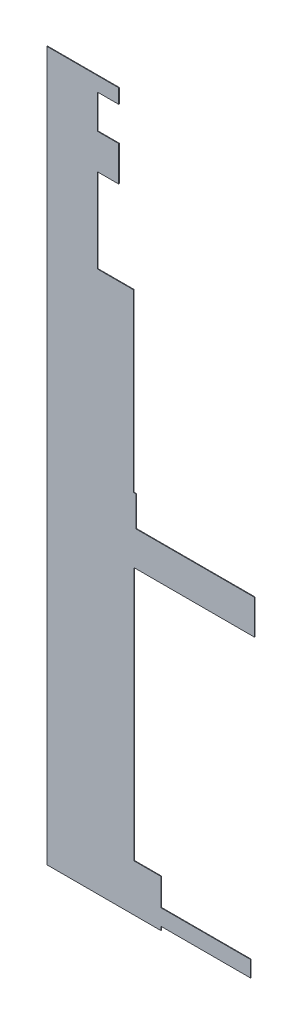
ISO-10303-21;
HEADER;
FILE_DESCRIPTION(('STEP AP214'),'2;1');
FILE_NAME('part.step','',(''),(''),'','','');
FILE_SCHEMA(('AUTOMOTIVE_DESIGN { 1 0 10303 214 1 1 1 1 }'));
ENDSEC;
DATA;
#1=APPLICATION_CONTEXT('core data for automotive mechanical design processes');
#2=APPLICATION_PROTOCOL_DEFINITION('international standard','automotive_design',2000,#1);
#3=PRODUCT_CONTEXT('',#1,'mechanical');
#4=PRODUCT('Part','Part','',(#3));
#5=PRODUCT_RELATED_PRODUCT_CATEGORY('part','',(#4));
#6=PRODUCT_DEFINITION_FORMATION('','',#4);
#7=PRODUCT_DEFINITION_CONTEXT('part definition',#1,'design');
#8=PRODUCT_DEFINITION('design','',#6,#7);
#9=PRODUCT_DEFINITION_SHAPE('','',#8);
#10=(LENGTH_UNIT() NAMED_UNIT(*) SI_UNIT(.MILLI.,.METRE.));
#11=(NAMED_UNIT(*) PLANE_ANGLE_UNIT() SI_UNIT($,.RADIAN.));
#12=(NAMED_UNIT(*) SI_UNIT($,.STERADIAN.) SOLID_ANGLE_UNIT());
#13=UNCERTAINTY_MEASURE_WITH_UNIT(LENGTH_MEASURE(1.E-05),#10,'distance_accuracy_value','');
#14=(GEOMETRIC_REPRESENTATION_CONTEXT(3) GLOBAL_UNCERTAINTY_ASSIGNED_CONTEXT((#13)) GLOBAL_UNIT_ASSIGNED_CONTEXT((#10,
#11,#12)) REPRESENTATION_CONTEXT('',''));
#15=CARTESIAN_POINT('',(0.,0.,0.));
#16=DIRECTION('',(0.,0.,1.));
#17=DIRECTION('',(1.,0.,0.));
#18=AXIS2_PLACEMENT_3D('',#15,#16,#17);
#19=CARTESIAN_POINT('',(0.,-1092.3,41.));
#20=DIRECTION('',(0.,1.,0.));
#21=DIRECTION('',(0.,0.,1.));
#22=AXIS2_PLACEMENT_3D('',#19,#20,#21);
#23=PLANE('',#22);
#24=DIRECTION('',(-1.,0.,0.));
#25=VECTOR('',#24,1.);
#26=CARTESIAN_POINT('',(0.,-1092.3,42.));
#27=LINE('',#26,#25);
#28=CARTESIAN_POINT('',(188.1,-1092.3,42.));
#29=VERTEX_POINT('',#28);
#30=CARTESIAN_POINT('',(143.400000000001,-1092.3,42.));
#31=VERTEX_POINT('',#30);
#32=EDGE_CURVE('E226',#29,#31,#27,.T.);
#33=ORIENTED_EDGE('',*,*,#32,.F.);
#34=DIRECTION('',(0.,0.,1.));
#35=VECTOR('',#34,1.);
#36=CARTESIAN_POINT('',(188.1,-1092.3,41.));
#37=LINE('',#36,#35);
#38=CARTESIAN_POINT('',(188.1,-1092.3,41.));
#39=VERTEX_POINT('',#38);
#40=EDGE_CURVE('E11',#39,#29,#37,.T.);
#41=ORIENTED_EDGE('',*,*,#40,.F.);
#42=DIRECTION('',(-1.,0.,0.));
#43=VECTOR('',#42,1.);
#44=CARTESIAN_POINT('',(0.,-1092.3,41.));
#45=LINE('',#44,#43);
#46=CARTESIAN_POINT('',(143.400000000001,-1092.3,41.));
#47=VERTEX_POINT('',#46);
#48=EDGE_CURVE('E389',#39,#47,#45,.T.);
#49=ORIENTED_EDGE('',*,*,#48,.T.);
#50=DIRECTION('',(0.,0.,1.));
#51=VECTOR('',#50,1.);
#52=CARTESIAN_POINT('',(143.400000000001,-1092.3,41.));
#53=LINE('',#52,#51);
#54=EDGE_CURVE('E37',#47,#31,#53,.T.);
#55=ORIENTED_EDGE('',*,*,#54,.T.);
#56=EDGE_LOOP('',(#33,#41,#49,#55));
#57=FACE_BOUND('',#56,.T.);
#58=ADVANCED_FACE('F34',(#57),#23,.T.);
#59=CARTESIAN_POINT('',(188.1,0.,41.));
#60=DIRECTION('',(1.,0.,0.));
#61=DIRECTION('',(0.,0.,-1.));
#62=AXIS2_PLACEMENT_3D('',#59,#60,#61);
#63=PLANE('',#62);
#64=DIRECTION('',(0.,1.,0.));
#65=VECTOR('',#64,1.);
#66=CARTESIAN_POINT('',(188.1,0.,42.));
#67=LINE('',#66,#65);
#68=CARTESIAN_POINT('',(188.1,-1137.1,42.));
#69=VERTEX_POINT('',#68);
#70=EDGE_CURVE('E287',#69,#29,#67,.T.);
#71=ORIENTED_EDGE('',*,*,#70,.F.);
#72=DIRECTION('',(0.,0.,1.));
#73=VECTOR('',#72,1.);
#74=CARTESIAN_POINT('',(188.1,-1137.1,41.));
#75=LINE('',#74,#73);
#76=CARTESIAN_POINT('',(188.1,-1137.1,41.));
#77=VERTEX_POINT('',#76);
#78=EDGE_CURVE('E43',#77,#69,#75,.T.);
#79=ORIENTED_EDGE('',*,*,#78,.F.);
#80=DIRECTION('',(0.,1.,0.));
#81=VECTOR('',#80,1.);
#82=CARTESIAN_POINT('',(188.1,0.,41.));
#83=LINE('',#82,#81);
#84=EDGE_CURVE('E217',#77,#39,#83,.T.);
#85=ORIENTED_EDGE('',*,*,#84,.T.);
#86=ORIENTED_EDGE('',*,*,#40,.T.);
#87=EDGE_LOOP('',(#71,#79,#85,#86));
#88=FACE_BOUND('',#87,.T.);
#89=ADVANCED_FACE('F393',(#88),#63,.T.);
#90=CARTESIAN_POINT('',(0.,-1137.1,41.));
#91=DIRECTION('',(0.,1.,0.));
#92=DIRECTION('',(0.,0.,1.));
#93=AXIS2_PLACEMENT_3D('',#90,#91,#92);
#94=PLANE('',#93);
#95=DIRECTION('',(-1.,0.,0.));
#96=VECTOR('',#95,1.);
#97=CARTESIAN_POINT('',(0.,-1137.1,42.));
#98=LINE('',#97,#96);
#99=CARTESIAN_POINT('',(336.,-1137.1,42.));
#100=VERTEX_POINT('',#99);
#101=EDGE_CURVE('E204',#100,#69,#98,.T.);
#102=ORIENTED_EDGE('',*,*,#101,.F.);
#103=DIRECTION('',(0.,0.,1.));
#104=VECTOR('',#103,1.);
#105=CARTESIAN_POINT('',(336.,-1137.1,41.));
#106=LINE('',#105,#104);
#107=CARTESIAN_POINT('',(336.,-1137.1,41.));
#108=VERTEX_POINT('',#107);
#109=EDGE_CURVE('E199',#108,#100,#106,.T.);
#110=ORIENTED_EDGE('',*,*,#109,.F.);
#111=DIRECTION('',(-1.,0.,0.));
#112=VECTOR('',#111,1.);
#113=CARTESIAN_POINT('',(0.,-1137.1,41.));
#114=LINE('',#113,#112);
#115=EDGE_CURVE('E202',#108,#77,#114,.T.);
#116=ORIENTED_EDGE('',*,*,#115,.T.);
#117=ORIENTED_EDGE('',*,*,#78,.T.);
#118=EDGE_LOOP('',(#102,#110,#116,#117));
#119=FACE_BOUND('',#118,.T.);
#120=ADVANCED_FACE('F201',(#119),#94,.T.);
#121=CARTESIAN_POINT('',(336.,0.,41.));
#122=DIRECTION('',(1.,0.,0.));
#123=DIRECTION('',(0.,0.,-1.));
#124=AXIS2_PLACEMENT_3D('',#121,#122,#123);
#125=PLANE('',#124);
#126=DIRECTION('',(0.,1.,0.));
#127=VECTOR('',#126,1.);
#128=CARTESIAN_POINT('',(336.,0.,42.));
#129=LINE('',#128,#127);
#130=CARTESIAN_POINT('',(336.,-1163.6,42.));
#131=VERTEX_POINT('',#130);
#132=EDGE_CURVE('E290',#131,#100,#129,.T.);
#133=ORIENTED_EDGE('',*,*,#132,.F.);
#134=DIRECTION('',(0.,0.,1.));
#135=VECTOR('',#134,1.);
#136=CARTESIAN_POINT('',(336.,-1163.6,41.));
#137=LINE('',#136,#135);
#138=CARTESIAN_POINT('',(336.,-1163.6,41.));
#139=VERTEX_POINT('',#138);
#140=EDGE_CURVE('E209',#139,#131,#137,.T.);
#141=ORIENTED_EDGE('',*,*,#140,.F.);
#142=DIRECTION('',(0.,1.,0.));
#143=VECTOR('',#142,1.);
#144=CARTESIAN_POINT('',(336.,0.,41.));
#145=LINE('',#144,#143);
#146=EDGE_CURVE('E215',#139,#108,#145,.T.);
#147=ORIENTED_EDGE('',*,*,#146,.T.);
#148=ORIENTED_EDGE('',*,*,#109,.T.);
#149=EDGE_LOOP('',(#133,#141,#147,#148));
#150=FACE_BOUND('',#149,.T.);
#151=ADVANCED_FACE('F219',(#150),#125,.T.);
#152=CARTESIAN_POINT('',(0.,-1163.6,41.));
#153=DIRECTION('',(0.,-1.,0.));
#154=DIRECTION('',(0.,0.,-1.));
#155=AXIS2_PLACEMENT_3D('',#152,#153,#154);
#156=PLANE('',#155);
#157=DIRECTION('',(1.,0.,0.));
#158=VECTOR('',#157,1.);
#159=CARTESIAN_POINT('',(0.,-1163.6,42.));
#160=LINE('',#159,#158);
#161=CARTESIAN_POINT('',(188.1,-1163.6,42.));
#162=VERTEX_POINT('',#161);
#163=EDGE_CURVE('E286',#162,#131,#160,.T.);
#164=ORIENTED_EDGE('',*,*,#163,.F.);
#165=DIRECTION('',(0.,0.,1.));
#166=VECTOR('',#165,1.);
#167=CARTESIAN_POINT('',(188.1,-1163.6,41.));
#168=LINE('',#167,#166);
#169=CARTESIAN_POINT('',(188.1,-1163.6,41.));
#170=VERTEX_POINT('',#169);
#171=EDGE_CURVE('E295',#170,#162,#168,.T.);
#172=ORIENTED_EDGE('',*,*,#171,.F.);
#173=DIRECTION('',(1.,0.,0.));
#174=VECTOR('',#173,1.);
#175=CARTESIAN_POINT('',(0.,-1163.6,41.));
#176=LINE('',#175,#174);
#177=EDGE_CURVE('E220',#170,#139,#176,.T.);
#178=ORIENTED_EDGE('',*,*,#177,.T.);
#179=ORIENTED_EDGE('',*,*,#140,.T.);
#180=EDGE_LOOP('',(#164,#172,#178,#179));
#181=FACE_BOUND('',#180,.T.);
#182=ADVANCED_FACE('F405',(#181),#156,.T.);
#183=CARTESIAN_POINT('',(188.1,-1169.8,42.));
#184=VERTEX_POINT('',#183);
#185=EDGE_CURVE('E283',#184,#162,#67,.T.);
#186=ORIENTED_EDGE('',*,*,#185,.F.);
#187=DIRECTION('',(0.,0.,1.));
#188=VECTOR('',#187,1.);
#189=CARTESIAN_POINT('',(188.1,-1169.8,41.));
#190=LINE('',#189,#188);
#191=CARTESIAN_POINT('',(188.1,-1169.8,41.));
#192=VERTEX_POINT('',#191);
#193=EDGE_CURVE('E297',#192,#184,#190,.T.);
#194=ORIENTED_EDGE('',*,*,#193,.F.);
#195=EDGE_CURVE('E222',#192,#170,#83,.T.);
#196=ORIENTED_EDGE('',*,*,#195,.T.);
#197=ORIENTED_EDGE('',*,*,#171,.T.);
#198=EDGE_LOOP('',(#186,#194,#196,#197));
#199=FACE_BOUND('',#198,.T.);
#200=ADVANCED_FACE('F396',(#199),#63,.T.);
#201=CARTESIAN_POINT('',(0.,-1169.8,41.));
#202=DIRECTION('',(0.,-1.,0.));
#203=DIRECTION('',(0.,0.,-1.));
#204=AXIS2_PLACEMENT_3D('',#201,#202,#203);
#205=PLANE('',#204);
#206=DIRECTION('',(1.,0.,0.));
#207=VECTOR('',#206,1.);
#208=CARTESIAN_POINT('',(0.,-1169.8,42.));
#209=LINE('',#208,#207);
#210=CARTESIAN_POINT('',(2.1316282072803E-13,-1169.8,42.));
#211=VERTEX_POINT('',#210);
#212=EDGE_CURVE('E280',#211,#184,#209,.T.);
#213=ORIENTED_EDGE('',*,*,#212,.F.);
#214=DIRECTION('',(0.,0.,1.));
#215=VECTOR('',#214,1.);
#216=CARTESIAN_POINT('',(2.1316282072803E-13,-1169.8,41.));
#217=LINE('',#216,#215);
#218=CARTESIAN_POINT('',(2.1316282072803E-13,-1169.8,41.));
#219=VERTEX_POINT('',#218);
#220=EDGE_CURVE('E299',#219,#211,#217,.T.);
#221=ORIENTED_EDGE('',*,*,#220,.F.);
#222=DIRECTION('',(1.,0.,0.));
#223=VECTOR('',#222,1.);
#224=CARTESIAN_POINT('',(0.,-1169.8,41.));
#225=LINE('',#224,#223);
#226=EDGE_CURVE('E334',#219,#192,#225,.T.);
#227=ORIENTED_EDGE('',*,*,#226,.T.);
#228=ORIENTED_EDGE('',*,*,#193,.T.);
#229=EDGE_LOOP('',(#213,#221,#227,#228));
#230=FACE_BOUND('',#229,.T.);
#231=ADVANCED_FACE('F404',(#230),#205,.T.);
#232=CARTESIAN_POINT('',(0.,0.,41.));
#233=DIRECTION('',(-1.,0.,0.));
#234=DIRECTION('',(0.,-1.,0.));
#235=AXIS2_PLACEMENT_3D('',#232,#233,#234);
#236=PLANE('',#235);
#237=DIRECTION('',(0.,-1.,0.));
#238=VECTOR('',#237,1.);
#239=CARTESIAN_POINT('',(0.,0.,42.));
#240=LINE('',#239,#238);
#241=CARTESIAN_POINT('',(0.,0.,42.));
#242=VERTEX_POINT('',#241);
#243=EDGE_CURVE('E277',#242,#211,#240,.T.);
#244=ORIENTED_EDGE('',*,*,#243,.F.);
#245=DIRECTION('',(0.,0.,1.));
#246=VECTOR('',#245,1.);
#247=CARTESIAN_POINT('',(0.,0.,41.));
#248=LINE('',#247,#246);
#249=CARTESIAN_POINT('',(0.,0.,41.));
#250=VERTEX_POINT('',#249);
#251=EDGE_CURVE('E301',#250,#242,#248,.T.);
#252=ORIENTED_EDGE('',*,*,#251,.F.);
#253=DIRECTION('',(0.,-1.,0.));
#254=VECTOR('',#253,1.);
#255=CARTESIAN_POINT('',(0.,0.,41.));
#256=LINE('',#255,#254);
#257=EDGE_CURVE('E338',#250,#219,#256,.T.);
#258=ORIENTED_EDGE('',*,*,#257,.T.);
#259=ORIENTED_EDGE('',*,*,#220,.T.);
#260=EDGE_LOOP('',(#244,#252,#258,#259));
#261=FACE_BOUND('',#260,.T.);
#262=ADVANCED_FACE('F410',(#261),#236,.T.);
#263=CARTESIAN_POINT('',(0.,0.,41.));
#264=DIRECTION('',(0.,1.,0.));
#265=DIRECTION('',(0.,0.,1.));
#266=AXIS2_PLACEMENT_3D('',#263,#264,#265);
#267=PLANE('',#266);
#268=DIRECTION('',(-1.,0.,0.));
#269=VECTOR('',#268,1.);
#270=CARTESIAN_POINT('',(0.,0.,42.));
#271=LINE('',#270,#269);
#272=CARTESIAN_POINT('',(118.4,0.,42.));
#273=VERTEX_POINT('',#272);
#274=EDGE_CURVE('E274',#273,#242,#271,.T.);
#275=ORIENTED_EDGE('',*,*,#274,.F.);
#276=DIRECTION('',(0.,0.,1.));
#277=VECTOR('',#276,1.);
#278=CARTESIAN_POINT('',(118.4,0.,41.));
#279=LINE('',#278,#277);
#280=CARTESIAN_POINT('',(118.4,0.,41.));
#281=VERTEX_POINT('',#280);
#282=EDGE_CURVE('E303',#281,#273,#279,.T.);
#283=ORIENTED_EDGE('',*,*,#282,.F.);
#284=DIRECTION('',(-1.,0.,0.));
#285=VECTOR('',#284,1.);
#286=CARTESIAN_POINT('',(0.,0.,41.));
#287=LINE('',#286,#285);
#288=EDGE_CURVE('E342',#281,#250,#287,.T.);
#289=ORIENTED_EDGE('',*,*,#288,.T.);
#290=ORIENTED_EDGE('',*,*,#251,.T.);
#291=EDGE_LOOP('',(#275,#283,#289,#290));
#292=FACE_BOUND('',#291,.T.);
#293=ADVANCED_FACE('F423',(#292),#267,.T.);
#294=CARTESIAN_POINT('',(118.4,0.,41.));
#295=DIRECTION('',(1.,0.,0.));
#296=DIRECTION('',(0.,0.,-1.));
#297=AXIS2_PLACEMENT_3D('',#294,#295,#296);
#298=PLANE('',#297);
#299=DIRECTION('',(0.,1.,0.));
#300=VECTOR('',#299,1.);
#301=CARTESIAN_POINT('',(118.4,0.,42.));
#302=LINE('',#301,#300);
#303=CARTESIAN_POINT('',(118.4,-23.7,42.));
#304=VERTEX_POINT('',#303);
#305=EDGE_CURVE('E271',#304,#273,#302,.T.);
#306=ORIENTED_EDGE('',*,*,#305,.F.);
#307=DIRECTION('',(0.,0.,1.));
#308=VECTOR('',#307,1.);
#309=CARTESIAN_POINT('',(118.4,-23.7,41.));
#310=LINE('',#309,#308);
#311=CARTESIAN_POINT('',(118.4,-23.7,41.));
#312=VERTEX_POINT('',#311);
#313=EDGE_CURVE('E305',#312,#304,#310,.T.);
#314=ORIENTED_EDGE('',*,*,#313,.F.);
#315=DIRECTION('',(0.,1.,0.));
#316=VECTOR('',#315,1.);
#317=CARTESIAN_POINT('',(118.4,0.,41.));
#318=LINE('',#317,#316);
#319=EDGE_CURVE('E347',#312,#281,#318,.T.);
#320=ORIENTED_EDGE('',*,*,#319,.T.);
#321=ORIENTED_EDGE('',*,*,#282,.T.);
#322=EDGE_LOOP('',(#306,#314,#320,#321));
#323=FACE_BOUND('',#322,.T.);
#324=ADVANCED_FACE('F428',(#323),#298,.T.);
#325=CARTESIAN_POINT('',(0.,-23.7,41.));
#326=DIRECTION('',(0.,-1.,0.));
#327=DIRECTION('',(0.,0.,-1.));
#328=AXIS2_PLACEMENT_3D('',#325,#326,#327);
#329=PLANE('',#328);
#330=DIRECTION('',(1.,0.,0.));
#331=VECTOR('',#330,1.);
#332=CARTESIAN_POINT('',(0.,-23.7,42.));
#333=LINE('',#332,#331);
#334=CARTESIAN_POINT('',(83.4,-23.7,42.));
#335=VERTEX_POINT('',#334);
#336=EDGE_CURVE('E268',#335,#304,#333,.T.);
#337=ORIENTED_EDGE('',*,*,#336,.F.);
#338=DIRECTION('',(0.,0.,1.));
#339=VECTOR('',#338,1.);
#340=CARTESIAN_POINT('',(83.4,-23.7,41.));
#341=LINE('',#340,#339);
#342=CARTESIAN_POINT('',(83.4,-23.7,41.));
#343=VERTEX_POINT('',#342);
#344=EDGE_CURVE('E307',#343,#335,#341,.T.);
#345=ORIENTED_EDGE('',*,*,#344,.F.);
#346=DIRECTION('',(1.,0.,0.));
#347=VECTOR('',#346,1.);
#348=CARTESIAN_POINT('',(0.,-23.7,41.));
#349=LINE('',#348,#347);
#350=EDGE_CURVE('E350',#343,#312,#349,.T.);
#351=ORIENTED_EDGE('',*,*,#350,.T.);
#352=ORIENTED_EDGE('',*,*,#313,.T.);
#353=EDGE_LOOP('',(#337,#345,#351,#352));
#354=FACE_BOUND('',#353,.T.);
#355=ADVANCED_FACE('F431',(#354),#329,.T.);
#356=CARTESIAN_POINT('',(83.4,0.,41.));
#357=DIRECTION('',(1.,0.,0.));
#358=DIRECTION('',(0.,0.,-1.));
#359=AXIS2_PLACEMENT_3D('',#356,#357,#358);
#360=PLANE('',#359);
#361=DIRECTION('',(0.,1.,0.));
#362=VECTOR('',#361,1.);
#363=CARTESIAN_POINT('',(83.4,0.,42.));
#364=LINE('',#363,#362);
#365=CARTESIAN_POINT('',(83.4,-79.7,42.));
#366=VERTEX_POINT('',#365);
#367=EDGE_CURVE('E265',#366,#335,#364,.T.);
#368=ORIENTED_EDGE('',*,*,#367,.F.);
#369=DIRECTION('',(0.,0.,1.));
#370=VECTOR('',#369,1.);
#371=CARTESIAN_POINT('',(83.4,-79.7,41.));
#372=LINE('',#371,#370);
#373=CARTESIAN_POINT('',(83.4,-79.7,41.));
#374=VERTEX_POINT('',#373);
#375=EDGE_CURVE('E309',#374,#366,#372,.T.);
#376=ORIENTED_EDGE('',*,*,#375,.F.);
#377=DIRECTION('',(0.,1.,0.));
#378=VECTOR('',#377,1.);
#379=CARTESIAN_POINT('',(83.4,0.,41.));
#380=LINE('',#379,#378);
#381=EDGE_CURVE('E353',#374,#343,#380,.T.);
#382=ORIENTED_EDGE('',*,*,#381,.T.);
#383=ORIENTED_EDGE('',*,*,#344,.T.);
#384=EDGE_LOOP('',(#368,#376,#382,#383));
#385=FACE_BOUND('',#384,.T.);
#386=ADVANCED_FACE('F436',(#385),#360,.T.);
#387=CARTESIAN_POINT('',(0.,-79.7,41.));
#388=DIRECTION('',(0.,1.,0.));
#389=DIRECTION('',(-1.,0.,0.));
#390=AXIS2_PLACEMENT_3D('',#387,#388,#389);
#391=PLANE('',#390);
#392=DIRECTION('',(-1.,0.,0.));
#393=VECTOR('',#392,1.);
#394=CARTESIAN_POINT('',(0.,-79.7,42.));
#395=LINE('',#394,#393);
#396=CARTESIAN_POINT('',(118.4,-79.7,42.));
#397=VERTEX_POINT('',#396);
#398=EDGE_CURVE('E262',#397,#366,#395,.T.);
#399=ORIENTED_EDGE('',*,*,#398,.F.);
#400=DIRECTION('',(0.,0.,1.));
#401=VECTOR('',#400,1.);
#402=CARTESIAN_POINT('',(118.4,-79.7,41.));
#403=LINE('',#402,#401);
#404=CARTESIAN_POINT('',(118.4,-79.7,41.));
#405=VERTEX_POINT('',#404);
#406=EDGE_CURVE('E311',#405,#397,#403,.T.);
#407=ORIENTED_EDGE('',*,*,#406,.F.);
#408=DIRECTION('',(-1.,0.,0.));
#409=VECTOR('',#408,1.);
#410=CARTESIAN_POINT('',(0.,-79.7,41.));
#411=LINE('',#410,#409);
#412=EDGE_CURVE('E356',#405,#374,#411,.T.);
#413=ORIENTED_EDGE('',*,*,#412,.T.);
#414=ORIENTED_EDGE('',*,*,#375,.T.);
#415=EDGE_LOOP('',(#399,#407,#413,#414));
#416=FACE_BOUND('',#415,.T.);
#417=ADVANCED_FACE('F439',(#416),#391,.T.);
#418=CARTESIAN_POINT('',(118.4,0.,41.));
#419=DIRECTION('',(1.,0.,0.));
#420=DIRECTION('',(0.,1.,0.));
#421=AXIS2_PLACEMENT_3D('',#418,#419,#420);
#422=PLANE('',#421);
#423=DIRECTION('',(0.,1.,0.));
#424=VECTOR('',#423,1.);
#425=CARTESIAN_POINT('',(118.4,0.,42.));
#426=LINE('',#425,#424);
#427=CARTESIAN_POINT('',(118.4,-137.6,42.));
#428=VERTEX_POINT('',#427);
#429=EDGE_CURVE('E259',#428,#397,#426,.T.);
#430=ORIENTED_EDGE('',*,*,#429,.F.);
#431=DIRECTION('',(0.,0.,1.));
#432=VECTOR('',#431,1.);
#433=CARTESIAN_POINT('',(118.4,-137.6,41.));
#434=LINE('',#433,#432);
#435=CARTESIAN_POINT('',(118.4,-137.6,41.));
#436=VERTEX_POINT('',#435);
#437=EDGE_CURVE('E313',#436,#428,#434,.T.);
#438=ORIENTED_EDGE('',*,*,#437,.F.);
#439=DIRECTION('',(0.,1.,0.));
#440=VECTOR('',#439,1.);
#441=CARTESIAN_POINT('',(118.4,0.,41.));
#442=LINE('',#441,#440);
#443=EDGE_CURVE('E359',#436,#405,#442,.T.);
#444=ORIENTED_EDGE('',*,*,#443,.T.);
#445=ORIENTED_EDGE('',*,*,#406,.T.);
#446=EDGE_LOOP('',(#430,#438,#444,#445));
#447=FACE_BOUND('',#446,.T.);
#448=ADVANCED_FACE('F444',(#447),#422,.T.);
#449=CARTESIAN_POINT('',(1.0911906299173E-13,-137.6,41.));
#450=DIRECTION('',(0.,-1.,0.));
#451=DIRECTION('',(1.,0.,0.));
#452=AXIS2_PLACEMENT_3D('',#449,#450,#451);
#453=PLANE('',#452);
#454=DIRECTION('',(1.,0.,0.));
#455=VECTOR('',#454,1.);
#456=CARTESIAN_POINT('',(1.0911906299173E-13,-137.6,42.));
#457=LINE('',#456,#455);
#458=CARTESIAN_POINT('',(83.4000000000001,-137.6,42.));
#459=VERTEX_POINT('',#458);
#460=EDGE_CURVE('E256',#459,#428,#457,.T.);
#461=ORIENTED_EDGE('',*,*,#460,.F.);
#462=DIRECTION('',(0.,0.,1.));
#463=VECTOR('',#462,1.);
#464=CARTESIAN_POINT('',(83.4000000000001,-137.6,41.));
#465=LINE('',#464,#463);
#466=CARTESIAN_POINT('',(83.4000000000001,-137.6,41.));
#467=VERTEX_POINT('',#466);
#468=EDGE_CURVE('E315',#467,#459,#465,.T.);
#469=ORIENTED_EDGE('',*,*,#468,.F.);
#470=DIRECTION('',(1.,0.,0.));
#471=VECTOR('',#470,1.);
#472=CARTESIAN_POINT('',(1.0911906299173E-13,-137.6,41.));
#473=LINE('',#472,#471);
#474=EDGE_CURVE('E362',#467,#436,#473,.T.);
#475=ORIENTED_EDGE('',*,*,#474,.T.);
#476=ORIENTED_EDGE('',*,*,#437,.T.);
#477=EDGE_LOOP('',(#461,#469,#475,#476));
#478=FACE_BOUND('',#477,.T.);
#479=ADVANCED_FACE('F447',(#478),#453,.T.);
#480=CARTESIAN_POINT('',(83.4000000000002,0.,41.));
#481=DIRECTION('',(-1.,0.,0.));
#482=DIRECTION('',(0.,0.,1.));
#483=AXIS2_PLACEMENT_3D('',#480,#481,#482);
#484=PLANE('',#483);
#485=DIRECTION('',(0.,-1.,0.));
#486=VECTOR('',#485,1.);
#487=CARTESIAN_POINT('',(83.4000000000002,0.,42.));
#488=LINE('',#487,#486);
#489=CARTESIAN_POINT('',(83.4000000000001,-276.5,42.));
#490=VERTEX_POINT('',#489);
#491=EDGE_CURVE('E253',#459,#490,#488,.T.);
#492=ORIENTED_EDGE('',*,*,#491,.T.);
#493=DIRECTION('',(0.,0.,1.));
#494=VECTOR('',#493,1.);
#495=CARTESIAN_POINT('',(83.4000000000001,-276.5,41.));
#496=LINE('',#495,#494);
#497=CARTESIAN_POINT('',(83.4000000000001,-276.5,41.));
#498=VERTEX_POINT('',#497);
#499=EDGE_CURVE('E317',#498,#490,#496,.T.);
#500=ORIENTED_EDGE('',*,*,#499,.F.);
#501=DIRECTION('',(0.,-1.,0.));
#502=VECTOR('',#501,1.);
#503=CARTESIAN_POINT('',(83.4000000000002,0.,41.));
#504=LINE('',#503,#502);
#505=EDGE_CURVE('E365',#467,#498,#504,.T.);
#506=ORIENTED_EDGE('',*,*,#505,.F.);
#507=ORIENTED_EDGE('',*,*,#468,.T.);
#508=EDGE_LOOP('',(#492,#500,#506,#507));
#509=FACE_BOUND('',#508,.T.);
#510=ADVANCED_FACE('F453',(#509),#484,.F.);
#511=CARTESIAN_POINT('',(2.57963585133492E-13,-276.5,41.));
#512=DIRECTION('',(0.,1.,0.));
#513=DIRECTION('',(-1.,0.,0.));
#514=AXIS2_PLACEMENT_3D('',#511,#512,#513);
#515=PLANE('',#514);
#516=DIRECTION('',(-1.,0.,0.));
#517=VECTOR('',#516,1.);
#518=CARTESIAN_POINT('',(2.57963585133492E-13,-276.5,42.));
#519=LINE('',#518,#517);
#520=CARTESIAN_POINT('',(142.9,-276.5,42.));
#521=VERTEX_POINT('',#520);
#522=EDGE_CURVE('E250',#521,#490,#519,.T.);
#523=ORIENTED_EDGE('',*,*,#522,.F.);
#524=DIRECTION('',(0.,0.,1.));
#525=VECTOR('',#524,1.);
#526=CARTESIAN_POINT('',(142.9,-276.5,41.));
#527=LINE('',#526,#525);
#528=CARTESIAN_POINT('',(142.9,-276.5,41.));
#529=VERTEX_POINT('',#528);
#530=EDGE_CURVE('E319',#529,#521,#527,.T.);
#531=ORIENTED_EDGE('',*,*,#530,.F.);
#532=DIRECTION('',(-1.,0.,0.));
#533=VECTOR('',#532,1.);
#534=CARTESIAN_POINT('',(2.57963585133492E-13,-276.5,41.));
#535=LINE('',#534,#533);
#536=EDGE_CURVE('E367',#529,#498,#535,.T.);
#537=ORIENTED_EDGE('',*,*,#536,.T.);
#538=ORIENTED_EDGE('',*,*,#499,.T.);
#539=EDGE_LOOP('',(#523,#531,#537,#538));
#540=FACE_BOUND('',#539,.T.);
#541=ADVANCED_FACE('F457',(#540),#515,.T.);
#542=CARTESIAN_POINT('',(142.9,0.,41.));
#543=DIRECTION('',(1.,0.,0.));
#544=DIRECTION('',(0.,1.,0.));
#545=AXIS2_PLACEMENT_3D('',#542,#543,#544);
#546=PLANE('',#545);
#547=DIRECTION('',(0.,1.,0.));
#548=VECTOR('',#547,1.);
#549=CARTESIAN_POINT('',(142.9,0.,42.));
#550=LINE('',#549,#548);
#551=CARTESIAN_POINT('',(142.9,-566.2,42.));
#552=VERTEX_POINT('',#551);
#553=EDGE_CURVE('E247',#552,#521,#550,.T.);
#554=ORIENTED_EDGE('',*,*,#553,.F.);
#555=DIRECTION('',(0.,0.,1.));
#556=VECTOR('',#555,1.);
#557=CARTESIAN_POINT('',(142.9,-566.2,41.));
#558=LINE('',#557,#556);
#559=CARTESIAN_POINT('',(142.9,-566.2,41.));
#560=VERTEX_POINT('',#559);
#561=EDGE_CURVE('E321',#560,#552,#558,.T.);
#562=ORIENTED_EDGE('',*,*,#561,.F.);
#563=DIRECTION('',(0.,1.,0.));
#564=VECTOR('',#563,1.);
#565=CARTESIAN_POINT('',(142.9,0.,41.));
#566=LINE('',#565,#564);
#567=EDGE_CURVE('E370',#560,#529,#566,.T.);
#568=ORIENTED_EDGE('',*,*,#567,.T.);
#569=ORIENTED_EDGE('',*,*,#530,.T.);
#570=EDGE_LOOP('',(#554,#562,#568,#569));
#571=FACE_BOUND('',#570,.T.);
#572=ADVANCED_FACE('F460',(#571),#546,.T.);
#573=CARTESIAN_POINT('',(0.,-566.2,41.));
#574=DIRECTION('',(0.,1.,0.));
#575=DIRECTION('',(0.,0.,1.));
#576=AXIS2_PLACEMENT_3D('',#573,#574,#575);
#577=PLANE('',#576);
#578=DIRECTION('',(-1.,0.,0.));
#579=VECTOR('',#578,1.);
#580=CARTESIAN_POINT('',(0.,-566.2,42.));
#581=LINE('',#580,#579);
#582=CARTESIAN_POINT('',(146.7,-566.2,42.));
#583=VERTEX_POINT('',#582);
#584=EDGE_CURVE('E244',#583,#552,#581,.T.);
#585=ORIENTED_EDGE('',*,*,#584,.F.);
#586=DIRECTION('',(0.,0.,1.));
#587=VECTOR('',#586,1.);
#588=CARTESIAN_POINT('',(146.7,-566.2,41.));
#589=LINE('',#588,#587);
#590=CARTESIAN_POINT('',(146.7,-566.2,41.));
#591=VERTEX_POINT('',#590);
#592=EDGE_CURVE('E323',#591,#583,#589,.T.);
#593=ORIENTED_EDGE('',*,*,#592,.F.);
#594=DIRECTION('',(-1.,0.,0.));
#595=VECTOR('',#594,1.);
#596=CARTESIAN_POINT('',(0.,-566.2,41.));
#597=LINE('',#596,#595);
#598=EDGE_CURVE('E373',#591,#560,#597,.T.);
#599=ORIENTED_EDGE('',*,*,#598,.T.);
#600=ORIENTED_EDGE('',*,*,#561,.T.);
#601=EDGE_LOOP('',(#585,#593,#599,#600));
#602=FACE_BOUND('',#601,.T.);
#603=ADVANCED_FACE('F465',(#602),#577,.T.);
#604=CARTESIAN_POINT('',(146.699999999994,1.62869717712504E-12,41.));
#605=DIRECTION('',(1.,0.,0.));
#606=DIRECTION('',(0.,1.,0.));
#607=AXIS2_PLACEMENT_3D('',#604,#605,#606);
#608=PLANE('',#607);
#609=DIRECTION('',(0.,1.,0.));
#610=VECTOR('',#609,1.);
#611=CARTESIAN_POINT('',(146.699999999994,1.62869717712504E-12,42.));
#612=LINE('',#611,#610);
#613=CARTESIAN_POINT('',(146.700000000001,-616.2,42.));
#614=VERTEX_POINT('',#613);
#615=EDGE_CURVE('E241',#614,#583,#612,.T.);
#616=ORIENTED_EDGE('',*,*,#615,.F.);
#617=DIRECTION('',(0.,0.,1.));
#618=VECTOR('',#617,1.);
#619=CARTESIAN_POINT('',(146.700000000001,-616.2,41.));
#620=LINE('',#619,#618);
#621=CARTESIAN_POINT('',(146.700000000001,-616.2,41.));
#622=VERTEX_POINT('',#621);
#623=EDGE_CURVE('E325',#622,#614,#620,.T.);
#624=ORIENTED_EDGE('',*,*,#623,.F.);
#625=DIRECTION('',(0.,1.,0.));
#626=VECTOR('',#625,1.);
#627=CARTESIAN_POINT('',(146.699999999994,1.62869717712504E-12,41.));
#628=LINE('',#627,#626);
#629=EDGE_CURVE('E376',#622,#591,#628,.T.);
#630=ORIENTED_EDGE('',*,*,#629,.T.);
#631=ORIENTED_EDGE('',*,*,#592,.T.);
#632=EDGE_LOOP('',(#616,#624,#630,#631));
#633=FACE_BOUND('',#632,.T.);
#634=ADVANCED_FACE('F468',(#633),#608,.T.);
#635=CARTESIAN_POINT('',(6.38511465922422E-12,-616.200000000002,41.));
#636=DIRECTION('',(0.,1.,0.));
#637=DIRECTION('',(-1.,0.,0.));
#638=AXIS2_PLACEMENT_3D('',#635,#636,#637);
#639=PLANE('',#638);
#640=DIRECTION('',(-1.,0.,0.));
#641=VECTOR('',#640,1.);
#642=CARTESIAN_POINT('',(6.38511465922422E-12,-616.200000000002,42.));
#643=LINE('',#642,#641);
#644=CARTESIAN_POINT('',(342.500000000001,-616.199999999998,42.));
#645=VERTEX_POINT('',#644);
#646=EDGE_CURVE('E238',#645,#614,#643,.T.);
#647=ORIENTED_EDGE('',*,*,#646,.F.);
#648=DIRECTION('',(0.,0.,1.));
#649=VECTOR('',#648,1.);
#650=CARTESIAN_POINT('',(342.500000000001,-616.199999999998,41.));
#651=LINE('',#650,#649);
#652=CARTESIAN_POINT('',(342.500000000001,-616.199999999998,41.));
#653=VERTEX_POINT('',#652);
#654=EDGE_CURVE('E327',#653,#645,#651,.T.);
#655=ORIENTED_EDGE('',*,*,#654,.F.);
#656=DIRECTION('',(-1.,0.,0.));
#657=VECTOR('',#656,1.);
#658=CARTESIAN_POINT('',(6.38511465922422E-12,-616.200000000002,41.));
#659=LINE('',#658,#657);
#660=EDGE_CURVE('E379',#653,#622,#659,.T.);
#661=ORIENTED_EDGE('',*,*,#660,.T.);
#662=ORIENTED_EDGE('',*,*,#623,.T.);
#663=EDGE_LOOP('',(#647,#655,#661,#662));
#664=FACE_BOUND('',#663,.T.);
#665=ADVANCED_FACE('F473',(#664),#639,.T.);
#666=CARTESIAN_POINT('',(342.499999999994,3.66909232041685E-12,41.));
#667=DIRECTION('',(1.,0.,0.));
#668=DIRECTION('',(0.,1.,0.));
#669=AXIS2_PLACEMENT_3D('',#666,#667,#668);
#670=PLANE('',#669);
#671=DIRECTION('',(0.,1.,0.));
#672=VECTOR('',#671,1.);
#673=CARTESIAN_POINT('',(342.499999999994,3.66909232041685E-12,42.));
#674=LINE('',#673,#672);
#675=CARTESIAN_POINT('',(342.500000000001,-673.199999999998,42.));
#676=VERTEX_POINT('',#675);
#677=EDGE_CURVE('E235',#676,#645,#674,.T.);
#678=ORIENTED_EDGE('',*,*,#677,.F.);
#679=DIRECTION('',(0.,0.,1.));
#680=VECTOR('',#679,1.);
#681=CARTESIAN_POINT('',(342.500000000001,-673.199999999998,41.));
#682=LINE('',#681,#680);
#683=CARTESIAN_POINT('',(342.500000000001,-673.199999999998,41.));
#684=VERTEX_POINT('',#683);
#685=EDGE_CURVE('E329',#684,#676,#682,.T.);
#686=ORIENTED_EDGE('',*,*,#685,.F.);
#687=DIRECTION('',(0.,1.,0.));
#688=VECTOR('',#687,1.);
#689=CARTESIAN_POINT('',(342.499999999994,3.66909232041685E-12,41.));
#690=LINE('',#689,#688);
#691=EDGE_CURVE('E382',#684,#653,#690,.T.);
#692=ORIENTED_EDGE('',*,*,#691,.T.);
#693=ORIENTED_EDGE('',*,*,#654,.T.);
#694=EDGE_LOOP('',(#678,#686,#692,#693));
#695=FACE_BOUND('',#694,.T.);
#696=ADVANCED_FACE('F476',(#695),#670,.T.);
#697=CARTESIAN_POINT('',(1.24567023362943E-12,-673.200000000001,41.));
#698=DIRECTION('',(0.,1.,0.));
#699=DIRECTION('',(-1.,0.,0.));
#700=AXIS2_PLACEMENT_3D('',#697,#698,#699);
#701=PLANE('',#700);
#702=DIRECTION('',(-1.,0.,0.));
#703=VECTOR('',#702,1.);
#704=CARTESIAN_POINT('',(1.24567023362943E-12,-673.200000000001,42.));
#705=LINE('',#704,#703);
#706=CARTESIAN_POINT('',(143.400000000001,-673.2,42.));
#707=VERTEX_POINT('',#706);
#708=EDGE_CURVE('E232',#676,#707,#705,.T.);
#709=ORIENTED_EDGE('',*,*,#708,.T.);
#710=DIRECTION('',(0.,0.,1.));
#711=VECTOR('',#710,1.);
#712=CARTESIAN_POINT('',(143.400000000001,-673.2,41.));
#713=LINE('',#712,#711);
#714=CARTESIAN_POINT('',(143.400000000001,-673.2,41.));
#715=VERTEX_POINT('',#714);
#716=EDGE_CURVE('E330',#715,#707,#713,.T.);
#717=ORIENTED_EDGE('',*,*,#716,.F.);
#718=DIRECTION('',(-1.,0.,0.));
#719=VECTOR('',#718,1.);
#720=CARTESIAN_POINT('',(1.24567023362943E-12,-673.200000000001,41.));
#721=LINE('',#720,#719);
#722=EDGE_CURVE('E385',#684,#715,#721,.T.);
#723=ORIENTED_EDGE('',*,*,#722,.F.);
#724=ORIENTED_EDGE('',*,*,#685,.T.);
#725=EDGE_LOOP('',(#709,#717,#723,#724));
#726=FACE_BOUND('',#725,.T.);
#727=ADVANCED_FACE('F479',(#726),#701,.F.);
#728=CARTESIAN_POINT('',(143.400000000001,0.,41.));
#729=DIRECTION('',(1.,0.,0.));
#730=DIRECTION('',(0.,1.,0.));
#731=AXIS2_PLACEMENT_3D('',#728,#729,#730);
#732=PLANE('',#731);
#733=DIRECTION('',(0.,1.,0.));
#734=VECTOR('',#733,1.);
#735=CARTESIAN_POINT('',(143.400000000001,0.,42.));
#736=LINE('',#735,#734);
#737=EDGE_CURVE('E229',#31,#707,#736,.T.);
#738=ORIENTED_EDGE('',*,*,#737,.F.);
#739=ORIENTED_EDGE('',*,*,#54,.F.);
#740=DIRECTION('',(0.,1.,0.));
#741=VECTOR('',#740,1.);
#742=CARTESIAN_POINT('',(143.400000000001,0.,41.));
#743=LINE('',#742,#741);
#744=EDGE_CURVE('E387',#47,#715,#743,.T.);
#745=ORIENTED_EDGE('',*,*,#744,.T.);
#746=ORIENTED_EDGE('',*,*,#716,.T.);
#747=EDGE_LOOP('',(#738,#739,#745,#746));
#748=FACE_BOUND('',#747,.T.);
#749=ADVANCED_FACE('F481',(#748),#732,.T.);
#750=CARTESIAN_POINT('',(0.,0.,41.));
#751=DIRECTION('',(0.,0.,1.));
#752=DIRECTION('',(1.,0.,0.));
#753=AXIS2_PLACEMENT_3D('',#750,#751,#752);
#754=PLANE('',#753);
#755=ORIENTED_EDGE('',*,*,#48,.F.);
#756=ORIENTED_EDGE('',*,*,#84,.F.);
#757=ORIENTED_EDGE('',*,*,#115,.F.);
#758=ORIENTED_EDGE('',*,*,#146,.F.);
#759=ORIENTED_EDGE('',*,*,#177,.F.);
#760=ORIENTED_EDGE('',*,*,#195,.F.);
#761=ORIENTED_EDGE('',*,*,#226,.F.);
#762=ORIENTED_EDGE('',*,*,#257,.F.);
#763=ORIENTED_EDGE('',*,*,#288,.F.);
#764=ORIENTED_EDGE('',*,*,#319,.F.);
#765=ORIENTED_EDGE('',*,*,#350,.F.);
#766=ORIENTED_EDGE('',*,*,#381,.F.);
#767=ORIENTED_EDGE('',*,*,#412,.F.);
#768=ORIENTED_EDGE('',*,*,#443,.F.);
#769=ORIENTED_EDGE('',*,*,#474,.F.);
#770=ORIENTED_EDGE('',*,*,#505,.T.);
#771=ORIENTED_EDGE('',*,*,#536,.F.);
#772=ORIENTED_EDGE('',*,*,#567,.F.);
#773=ORIENTED_EDGE('',*,*,#598,.F.);
#774=ORIENTED_EDGE('',*,*,#629,.F.);
#775=ORIENTED_EDGE('',*,*,#660,.F.);
#776=ORIENTED_EDGE('',*,*,#691,.F.);
#777=ORIENTED_EDGE('',*,*,#722,.T.);
#778=ORIENTED_EDGE('',*,*,#744,.F.);
#779=EDGE_LOOP('',(#755,#756,#757,#758,#759,#760,#761,#762,#763,#764,#765,#766,#767,#768,#769,
#770,#771,#772,#773,#774,#775,#776,#777,#778));
#780=FACE_BOUND('',#779,.T.);
#781=ADVANCED_FACE('F213',(#780),#754,.F.);
#782=CARTESIAN_POINT('',(0.,0.,42.));
#783=DIRECTION('',(0.,0.,1.));
#784=DIRECTION('',(1.,0.,0.));
#785=AXIS2_PLACEMENT_3D('',#782,#783,#784);
#786=PLANE('',#785);
#787=ORIENTED_EDGE('',*,*,#32,.T.);
#788=ORIENTED_EDGE('',*,*,#737,.T.);
#789=ORIENTED_EDGE('',*,*,#708,.F.);
#790=ORIENTED_EDGE('',*,*,#677,.T.);
#791=ORIENTED_EDGE('',*,*,#646,.T.);
#792=ORIENTED_EDGE('',*,*,#615,.T.);
#793=ORIENTED_EDGE('',*,*,#584,.T.);
#794=ORIENTED_EDGE('',*,*,#553,.T.);
#795=ORIENTED_EDGE('',*,*,#522,.T.);
#796=ORIENTED_EDGE('',*,*,#491,.F.);
#797=ORIENTED_EDGE('',*,*,#460,.T.);
#798=ORIENTED_EDGE('',*,*,#429,.T.);
#799=ORIENTED_EDGE('',*,*,#398,.T.);
#800=ORIENTED_EDGE('',*,*,#367,.T.);
#801=ORIENTED_EDGE('',*,*,#336,.T.);
#802=ORIENTED_EDGE('',*,*,#305,.T.);
#803=ORIENTED_EDGE('',*,*,#274,.T.);
#804=ORIENTED_EDGE('',*,*,#243,.T.);
#805=ORIENTED_EDGE('',*,*,#212,.T.);
#806=ORIENTED_EDGE('',*,*,#185,.T.);
#807=ORIENTED_EDGE('',*,*,#163,.T.);
#808=ORIENTED_EDGE('',*,*,#132,.T.);
#809=ORIENTED_EDGE('',*,*,#101,.T.);
#810=ORIENTED_EDGE('',*,*,#70,.T.);
#811=EDGE_LOOP('',(#787,#788,#789,#790,#791,#792,#793,#794,#795,#796,#797,#798,#799,#800,#801,
#802,#803,#804,#805,#806,#807,#808,#809,#810));
#812=FACE_BOUND('',#811,.T.);
#813=ADVANCED_FACE('F392',(#812),#786,.T.);
#814=CLOSED_SHELL('',(#58,#89,#120,#151,#182,#200,#231,#262,#293,#324,#355,#386,#417,#448,#479,
#510,#541,#572,#603,#634,#665,#696,#727,#749,#781,#813));
#815=MANIFOLD_SOLID_BREP('B2',#814);
#816=ADVANCED_BREP_SHAPE_REPRESENTATION('',(#18,#815),#14);
#817=SHAPE_DEFINITION_REPRESENTATION(#9,#816);
ENDSEC;
END-ISO-10303-21;
